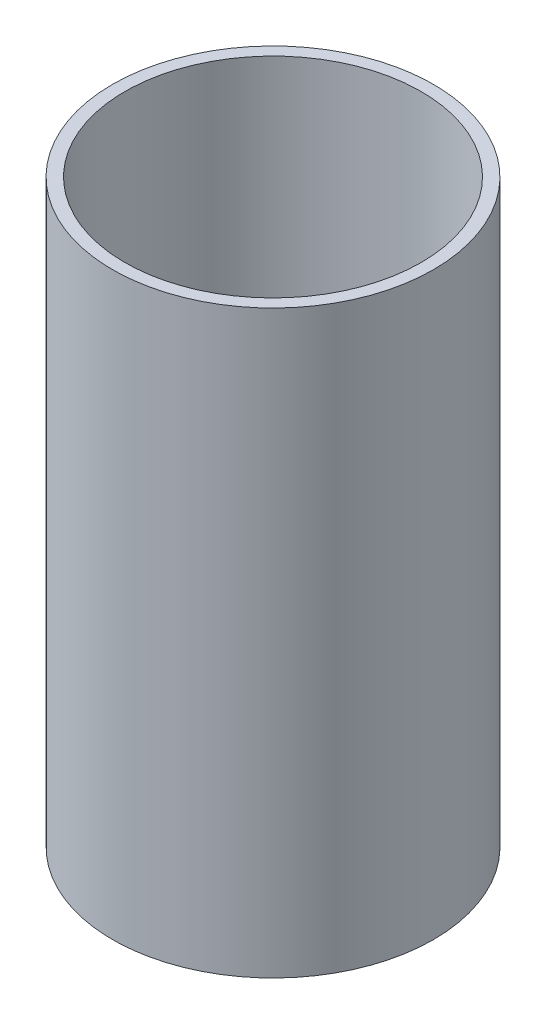
ISO-10303-21;
HEADER;
FILE_DESCRIPTION(('STEP AP214'),'2;1');
FILE_NAME('part.step','',(''),(''),'','','');
FILE_SCHEMA(('AUTOMOTIVE_DESIGN { 1 0 10303 214 1 1 1 1 }'));
ENDSEC;
DATA;
#1=APPLICATION_CONTEXT('core data for automotive mechanical design processes');
#2=APPLICATION_PROTOCOL_DEFINITION('international standard','automotive_design',2000,#1);
#3=PRODUCT_CONTEXT('',#1,'mechanical');
#4=PRODUCT('Part','Part','',(#3));
#5=PRODUCT_RELATED_PRODUCT_CATEGORY('part','',(#4));
#6=PRODUCT_DEFINITION_FORMATION('','',#4);
#7=PRODUCT_DEFINITION_CONTEXT('part definition',#1,'design');
#8=PRODUCT_DEFINITION('design','',#6,#7);
#9=PRODUCT_DEFINITION_SHAPE('','',#8);
#10=(LENGTH_UNIT() NAMED_UNIT(*) SI_UNIT(.MILLI.,.METRE.));
#11=(NAMED_UNIT(*) PLANE_ANGLE_UNIT() SI_UNIT($,.RADIAN.));
#12=(NAMED_UNIT(*) SI_UNIT($,.STERADIAN.) SOLID_ANGLE_UNIT());
#13=UNCERTAINTY_MEASURE_WITH_UNIT(LENGTH_MEASURE(1.E-05),#10,'distance_accuracy_value','');
#14=(GEOMETRIC_REPRESENTATION_CONTEXT(3) GLOBAL_UNCERTAINTY_ASSIGNED_CONTEXT((#13)) GLOBAL_UNIT_ASSIGNED_CONTEXT((#10,
#11,#12)) REPRESENTATION_CONTEXT('',''));
#15=CARTESIAN_POINT('',(0.,0.,0.));
#16=DIRECTION('',(0.,0.,1.));
#17=DIRECTION('',(1.,0.,0.));
#18=AXIS2_PLACEMENT_3D('',#15,#16,#17);
#19=CARTESIAN_POINT('',(0.,0.,0.));
#20=DIRECTION('',(0.,-1.,0.));
#21=DIRECTION('',(1.,0.,0.));
#22=AXIS2_PLACEMENT_3D('',#19,#20,#21);
#23=CYLINDRICAL_SURFACE('',#22,76.2000000000005);
#24=CARTESIAN_POINT('',(0.,-2.61384973715095E-13,0.));
#25=DIRECTION('',(0.,-1.,0.));
#26=DIRECTION('',(1.,0.,0.));
#27=AXIS2_PLACEMENT_3D('',#24,#25,#26);
#28=CIRCLE('',#27,76.2);
#29=CARTESIAN_POINT('',(76.2,0.,0.));
#30=VERTEX_POINT('',#29);
#31=EDGE_CURVE('E61',#30,#30,#28,.T.);
#32=ORIENTED_EDGE('',*,*,#31,.T.);
#33=EDGE_LOOP('',(#32));
#34=FACE_BOUND('',#33,.T.);
#35=CARTESIAN_POINT('',(-1.02375781371746E-12,298.45,0.));
#36=DIRECTION('',(0.,-1.,0.));
#37=DIRECTION('',(1.,0.,0.));
#38=AXIS2_PLACEMENT_3D('',#35,#36,#37);
#39=CIRCLE('',#38,76.200000000001);
#40=CARTESIAN_POINT('',(76.2,298.45,0.));
#41=VERTEX_POINT('',#40);
#42=EDGE_CURVE('E10',#41,#41,#39,.T.);
#43=ORIENTED_EDGE('',*,*,#42,.F.);
#44=EDGE_LOOP('',(#43));
#45=FACE_BOUND('',#44,.T.);
#46=ADVANCED_FACE('F44',(#34,#45),#23,.F.);
#47=CARTESIAN_POINT('',(76.2,298.45,0.));
#48=DIRECTION('',(0.,1.,0.));
#49=DIRECTION('',(-1.,0.,0.));
#50=AXIS2_PLACEMENT_3D('',#47,#48,#49);
#51=PLANE('',#50);
#52=ORIENTED_EDGE('',*,*,#42,.T.);
#53=EDGE_LOOP('',(#52));
#54=FACE_BOUND('',#53,.T.);
#55=CARTESIAN_POINT('',(-1.02375781371746E-12,298.45,0.));
#56=DIRECTION('',(0.,-1.,0.));
#57=DIRECTION('',(1.,0.,0.));
#58=AXIS2_PLACEMENT_3D('',#55,#56,#57);
#59=CIRCLE('',#58,82.550000000001);
#60=CARTESIAN_POINT('',(82.55,298.45,0.));
#61=VERTEX_POINT('',#60);
#62=EDGE_CURVE('E51',#61,#61,#59,.T.);
#63=ORIENTED_EDGE('',*,*,#62,.F.);
#64=EDGE_LOOP('',(#63));
#65=FACE_BOUND('',#64,.T.);
#66=ADVANCED_FACE('F78',(#54,#65),#51,.T.);
#67=CARTESIAN_POINT('',(0.,0.,0.));
#68=DIRECTION('',(0.,-1.,0.));
#69=DIRECTION('',(1.,0.,0.));
#70=AXIS2_PLACEMENT_3D('',#67,#68,#69);
#71=CYLINDRICAL_SURFACE('',#70,82.5500000000005);
#72=ORIENTED_EDGE('',*,*,#62,.T.);
#73=EDGE_LOOP('',(#72));
#74=FACE_BOUND('',#73,.T.);
#75=CARTESIAN_POINT('',(0.,-2.8316705485802E-13,0.));
#76=DIRECTION('',(0.,-1.,0.));
#77=DIRECTION('',(1.,0.,0.));
#78=AXIS2_PLACEMENT_3D('',#75,#76,#77);
#79=CIRCLE('',#78,82.55);
#80=CARTESIAN_POINT('',(82.55,0.,0.));
#81=VERTEX_POINT('',#80);
#82=EDGE_CURVE('E56',#81,#81,#79,.T.);
#83=ORIENTED_EDGE('',*,*,#82,.F.);
#84=EDGE_LOOP('',(#83));
#85=FACE_BOUND('',#84,.T.);
#86=ADVANCED_FACE('F72',(#74,#85),#71,.T.);
#87=CARTESIAN_POINT('',(76.2,0.,0.));
#88=DIRECTION('',(0.,-1.,0.));
#89=DIRECTION('',(1.,0.,0.));
#90=AXIS2_PLACEMENT_3D('',#87,#88,#89);
#91=PLANE('',#90);
#92=ORIENTED_EDGE('',*,*,#82,.T.);
#93=EDGE_LOOP('',(#92));
#94=FACE_BOUND('',#93,.T.);
#95=ORIENTED_EDGE('',*,*,#31,.F.);
#96=EDGE_LOOP('',(#95));
#97=FACE_BOUND('',#96,.T.);
#98=ADVANCED_FACE('F70',(#94,#97),#91,.T.);
#99=CLOSED_SHELL('',(#46,#66,#86,#98));
#100=MANIFOLD_SOLID_BREP('B2',#99);
#101=ADVANCED_BREP_SHAPE_REPRESENTATION('',(#18,#100),#14);
#102=SHAPE_DEFINITION_REPRESENTATION(#9,#101);
ENDSEC;
END-ISO-10303-21;
